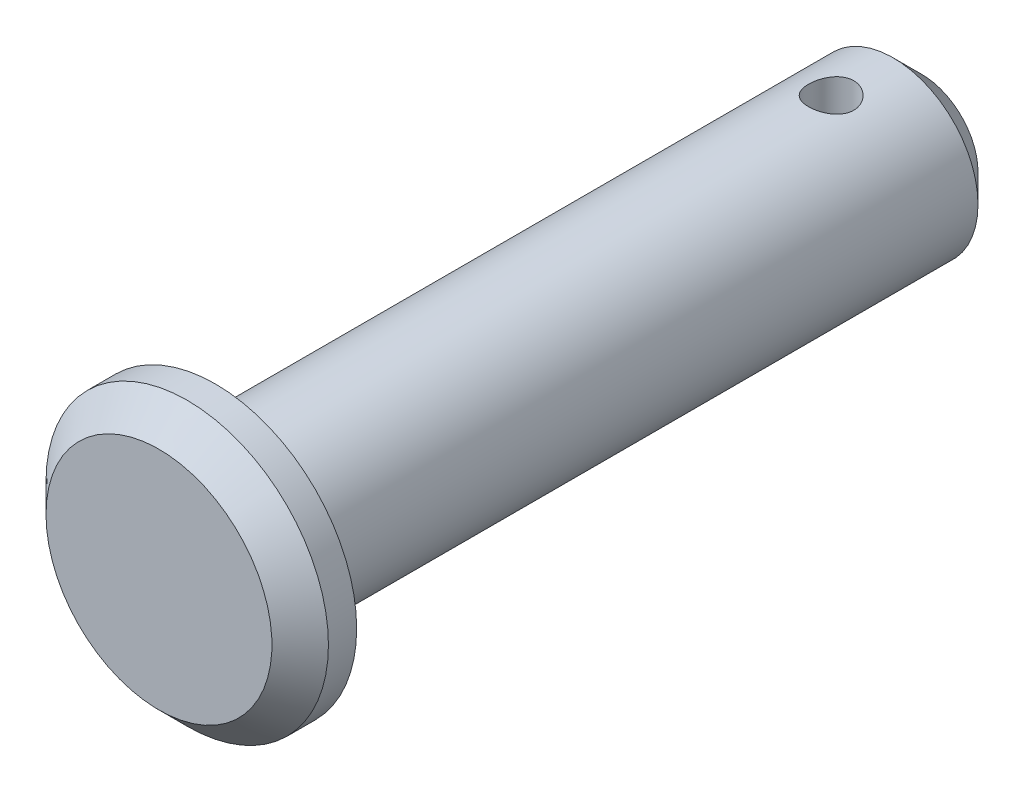
ISO-10303-21;
HEADER;
FILE_DESCRIPTION(('STEP AP214'),'2;1');
FILE_NAME('part.step','',(''),(''),'','','');
FILE_SCHEMA(('AUTOMOTIVE_DESIGN { 1 0 10303 214 1 1 1 1 }'));
ENDSEC;
DATA;
#1=APPLICATION_CONTEXT('core data for automotive mechanical design processes');
#2=APPLICATION_PROTOCOL_DEFINITION('international standard','automotive_design',2000,#1);
#3=PRODUCT_CONTEXT('',#1,'mechanical');
#4=PRODUCT('Part','Part','',(#3));
#5=PRODUCT_RELATED_PRODUCT_CATEGORY('part','',(#4));
#6=PRODUCT_DEFINITION_FORMATION('','',#4);
#7=PRODUCT_DEFINITION_CONTEXT('part definition',#1,'design');
#8=PRODUCT_DEFINITION('design','',#6,#7);
#9=PRODUCT_DEFINITION_SHAPE('','',#8);
#10=(LENGTH_UNIT() NAMED_UNIT(*) SI_UNIT(.MILLI.,.METRE.));
#11=(NAMED_UNIT(*) PLANE_ANGLE_UNIT() SI_UNIT($,.RADIAN.));
#12=(NAMED_UNIT(*) SI_UNIT($,.STERADIAN.) SOLID_ANGLE_UNIT());
#13=UNCERTAINTY_MEASURE_WITH_UNIT(LENGTH_MEASURE(1.E-05),#10,'distance_accuracy_value','');
#14=(GEOMETRIC_REPRESENTATION_CONTEXT(3) GLOBAL_UNCERTAINTY_ASSIGNED_CONTEXT((#13)) GLOBAL_UNIT_ASSIGNED_CONTEXT((#10,
#11,#12)) REPRESENTATION_CONTEXT('',''));
#15=CARTESIAN_POINT('',(0.,0.,0.));
#16=DIRECTION('',(0.,0.,1.));
#17=DIRECTION('',(1.,0.,0.));
#18=AXIS2_PLACEMENT_3D('',#15,#16,#17);
#19=CARTESIAN_POINT('',(0.,-20.1940334543548,3.2));
#20=DIRECTION('',(0.,1.,0.));
#21=DIRECTION('',(0.,0.,1.));
#22=AXIS2_PLACEMENT_3D('',#19,#20,#21);
#23=CYLINDRICAL_SURFACE('',#22,0.8);
#24=CARTESIAN_POINT('',(0.,-3.,4.));
#25=CARTESIAN_POINT('',(-0.0441018223331423,-2.99999933524065,3.99999895322606));
#26=CARTESIAN_POINT('',(-0.0882148640887374,-2.99901794464862,3.99634095432413));
#27=CARTESIAN_POINT('',(-0.175170180541785,-2.99519829448663,3.98183150770452));
#28=CARTESIAN_POINT('',(-0.218011833327633,-2.9923591413303,3.97097659822954));
#29=CARTESIAN_POINT('',(-0.301156635618126,-2.98513733301121,3.94245133325437));
#30=CARTESIAN_POINT('',(-0.34146298040612,-2.98075666852169,3.92478976493358));
#31=CARTESIAN_POINT('',(-0.418541474557067,-2.97091479660652,3.88318510293336));
#32=CARTESIAN_POINT('',(-0.455313388179847,-2.96545351718002,3.8592415906563));
#33=CARTESIAN_POINT('',(-0.525131801496009,-2.95389845960869,3.80516659343462));
#34=CARTESIAN_POINT('',(-0.55808467594513,-2.9477938707174,3.7749165327966));
#35=CARTESIAN_POINT('',(-0.618514854642545,-2.93570963871569,3.70934060677474));
#36=CARTESIAN_POINT('',(-0.645991453982616,-2.92973001177898,3.67401408895329));
#37=CARTESIAN_POINT('',(-0.695145636973702,-2.91846214986764,3.59854070606949));
#38=CARTESIAN_POINT('',(-0.716715510946112,-2.91318755429117,3.5583214686941));
#39=CARTESIAN_POINT('',(-0.752750192307821,-2.90408590923454,3.47466395556422));
#40=CARTESIAN_POINT('',(-0.767216309804883,-2.9002585928704,3.4312262750719));
#41=CARTESIAN_POINT('',(-0.7883076809057,-2.89459646334927,3.34340178486933));
#42=CARTESIAN_POINT('',(-0.795102680979745,-2.89271859176123,3.29905858401913));
#43=CARTESIAN_POINT('',(-0.801188138824371,-2.89103932417876,3.20982492666682));
#44=CARTESIAN_POINT('',(-0.800479998822945,-2.89123754019361,3.16493457398574));
#45=CARTESIAN_POINT('',(-0.791714040010483,-2.89364951507618,3.07720583385104));
#46=CARTESIAN_POINT('',(-0.783861624258972,-2.89580694201076,3.03434512718478));
#47=CARTESIAN_POINT('',(-0.761358994888813,-2.90180405235812,2.95057266621731));
#48=CARTESIAN_POINT('',(-0.746708237972003,-2.90564387021998,2.9096610679698));
#49=CARTESIAN_POINT('',(-0.710857427861,-2.91462264698391,2.83041274247661));
#50=CARTESIAN_POINT('',(-0.689585364551126,-2.91977577127223,2.7921102642855));
#51=CARTESIAN_POINT('',(-0.641146015295112,-2.93079291857237,2.71954633645937));
#52=CARTESIAN_POINT('',(-0.613977568897008,-2.93665708142145,2.6852856843374));
#53=CARTESIAN_POINT('',(-0.553466429053674,-2.94867004251873,2.62060440101807));
#54=CARTESIAN_POINT('',(-0.519951250913191,-2.95482188595513,2.59034547267402));
#55=CARTESIAN_POINT('',(-0.448247067282543,-2.96654552510546,2.53584448785988));
#56=CARTESIAN_POINT('',(-0.410057877682035,-2.97211729795427,2.51160266851902));
#57=CARTESIAN_POINT('',(-0.32983930219898,-2.98208728159312,2.46975283887013));
#58=CARTESIAN_POINT('',(-0.287793961020712,-2.98648029133423,2.45217409182056));
#59=CARTESIAN_POINT('',(-0.201200917756154,-2.99356017760401,2.42438112447465));
#60=CARTESIAN_POINT('',(-0.156653764771328,-2.996247426935,2.41416529491041));
#61=CARTESIAN_POINT('',(-0.0677016332582068,-2.99955663423354,2.40164204923286));
#62=CARTESIAN_POINT('',(-0.0233296950565524,-3.00023598988385,2.39911478405965));
#63=CARTESIAN_POINT('',(0.0652040183604796,-2.99961788676677,2.40143326569878));
#64=CARTESIAN_POINT('',(0.109365814824846,-2.99832063232137,2.4062782504423));
#65=CARTESIAN_POINT('',(0.195440979960712,-2.99393214198412,2.42302337898399));
#66=CARTESIAN_POINT('',(0.237379940811113,-2.99087210618546,2.43480089847911));
#67=CARTESIAN_POINT('',(0.31868278847042,-2.98330517957641,2.46493437780317));
#68=CARTESIAN_POINT('',(0.358046395686399,-2.9787981319841,2.48329105050017));
#69=CARTESIAN_POINT('',(0.433935389867192,-2.96870264223868,2.52646955487224));
#70=CARTESIAN_POINT('',(0.470390075384516,-2.96309474642193,2.55141098671923));
#71=CARTESIAN_POINT('',(0.538673854158807,-2.95144580946015,2.60690065206306));
#72=CARTESIAN_POINT('',(0.570502031519497,-2.94540468290222,2.6374499930399));
#73=CARTESIAN_POINT('',(0.629555697915275,-2.9333589834749,2.70431423099834));
#74=CARTESIAN_POINT('',(0.656626076999939,-2.92736024574782,2.74076742456005));
#75=CARTESIAN_POINT('',(0.704268764739789,-2.91626578870035,2.81782587843785));
#76=CARTESIAN_POINT('',(0.724841344486107,-2.91117003171109,2.85843096544148));
#77=CARTESIAN_POINT('',(0.758749646345945,-2.9025170736066,2.94243812283527));
#78=CARTESIAN_POINT('',(0.772127249023588,-2.89895099369493,2.98582232474924));
#79=CARTESIAN_POINT('',(0.79136482048317,-2.89375930092876,3.07433572789352));
#80=CARTESIAN_POINT('',(0.797226710411951,-2.89213319219128,3.11946448014682));
#81=CARTESIAN_POINT('',(0.801155958613013,-2.89104697818674,3.20859791514901));
#82=CARTESIAN_POINT('',(0.799472622471942,-2.89151759094413,3.2525909281021));
#83=CARTESIAN_POINT('',(0.78893750400225,-2.89440958435318,3.33964140560521));
#84=CARTESIAN_POINT('',(0.780085906140233,-2.89683091480545,3.38269889420054));
#85=CARTESIAN_POINT('',(0.755610062798667,-2.903310284285,3.46634230085161));
#86=CARTESIAN_POINT('',(0.740038644302288,-2.90735554007653,3.50694473709278));
#87=CARTESIAN_POINT('',(0.702606218249582,-2.91662727254676,3.58499153221374));
#88=CARTESIAN_POINT('',(0.680744224098475,-2.92185393448601,3.62243539452021));
#89=CARTESIAN_POINT('',(0.630595637075257,-2.93309168576127,3.69429214379862));
#90=CARTESIAN_POINT('',(0.602138919071638,-2.93912133240661,3.72858341399048));
#91=CARTESIAN_POINT('',(0.539932214044406,-2.95118201513218,3.79198498066693));
#92=CARTESIAN_POINT('',(0.506180941743499,-2.95721305119381,3.82109401546753));
#93=CARTESIAN_POINT('',(0.433471992435473,-2.96875124961583,3.87391689505873));
#94=CARTESIAN_POINT('',(0.394418384700715,-2.97424444525819,3.89750200425973));
#95=CARTESIAN_POINT('',(0.31275545616676,-2.9839352404116,3.93773496637174));
#96=CARTESIAN_POINT('',(0.270148437878519,-2.98813367073438,3.95438727026543));
#97=CARTESIAN_POINT('',(0.189749881952395,-2.99421901005387,3.9781101141662));
#98=CARTESIAN_POINT('',(0.152304806626014,-2.99637108237041,3.986299753437));
#99=CARTESIAN_POINT('',(0.0765759181268316,-2.99926179614582,3.99724488246683));
#100=CARTESIAN_POINT('',(0.0382921881619447,-3.00000057718908,4.00000090888001));
#101=CARTESIAN_POINT('',(0.,-3.,4.));
#102=B_SPLINE_CURVE_WITH_KNOTS('',3,(#24,#25,#26,#27,#28,#29,#30,#31,#32,#33,#34,#35,#36,#37,
#38,#39,#40,#41,#42,#43,#44,#45,#46,#47,#48,#49,#50,#51,#52,#53,#54,#55,#56,#57,#58,#59,#60,#61,
#62,#63,#64,#65,#66,#67,#68,#69,#70,#71,#72,#73,#74,#75,#76,#77,#78,#79,#80,#81,#82,#83,#84,#85,
#86,#87,#88,#89,#90,#91,#92,#93,#94,#95,#96,#97,#98,#99,#100,#101),.UNSPECIFIED.,.T.,.F.,(4,2,2,
2,2,2,2,2,2,2,2,2,2,2,2,2,2,2,2,2,2,2,2,2,2,2,2,2,2,2,2,2,2,2,2,2,2,2,4),(0.,0.132165039579828,
0.264393697504583,0.396452221188777,0.528519546834705,0.663339591819872,0.798176979700601,
0.935330330092923,1.07245837651881,1.20648863299036,1.34049384159394,1.47076400816065,
1.60104458722842,1.73279469336265,1.86457075244718,2.00064503922595,2.13672468772705,
2.27339523838883,2.41003590873721,2.54273087007485,2.67541211567806,2.80581414254512,
2.93623030307911,3.06920114399486,3.2021982730122,3.33894598550781,3.47568799207308,
3.61162519076595,3.7475276346153,3.87897336957382,4.01041572204174,4.14084306175258,
4.27129086845138,4.40557735824493,4.53989649728917,4.67708900908296,4.81419330454009,
4.92895927593272,5.04371391182491),.UNSPECIFIED.);
#103=CARTESIAN_POINT('',(0.,-3.,4.));
#104=VERTEX_POINT('',#103);
#105=EDGE_CURVE('E19',#104,#104,#102,.F.);
#106=ORIENTED_EDGE('',*,*,#105,.F.);
#107=EDGE_LOOP('',(#106));
#108=FACE_BOUND('',#107,.T.);
#109=CARTESIAN_POINT('',(0.,3.,4.));
#110=CARTESIAN_POINT('',(0.0441018223331423,2.99999933524065,3.99999895322606));
#111=CARTESIAN_POINT('',(0.0882148640887374,2.99901794464862,3.99634095432413));
#112=CARTESIAN_POINT('',(0.175170180541785,2.99519829448663,3.98183150770452));
#113=CARTESIAN_POINT('',(0.218011833327633,2.9923591413303,3.97097659822954));
#114=CARTESIAN_POINT('',(0.301156635618126,2.98513733301121,3.94245133325437));
#115=CARTESIAN_POINT('',(0.34146298040612,2.98075666852169,3.92478976493358));
#116=CARTESIAN_POINT('',(0.418541474557067,2.97091479660652,3.88318510293336));
#117=CARTESIAN_POINT('',(0.455313388179847,2.96545351718002,3.8592415906563));
#118=CARTESIAN_POINT('',(0.525131801496009,2.95389845960869,3.80516659343462));
#119=CARTESIAN_POINT('',(0.55808467594513,2.9477938707174,3.7749165327966));
#120=CARTESIAN_POINT('',(0.618514854642545,2.93570963871569,3.70934060677474));
#121=CARTESIAN_POINT('',(0.645991453982616,2.92973001177898,3.67401408895329));
#122=CARTESIAN_POINT('',(0.695145636973702,2.91846214986764,3.59854070606949));
#123=CARTESIAN_POINT('',(0.716715510946112,2.91318755429117,3.5583214686941));
#124=CARTESIAN_POINT('',(0.752750192307821,2.90408590923454,3.47466395556422));
#125=CARTESIAN_POINT('',(0.767216309804883,2.9002585928704,3.4312262750719));
#126=CARTESIAN_POINT('',(0.7883076809057,2.89459646334927,3.34340178486933));
#127=CARTESIAN_POINT('',(0.795102680979745,2.89271859176123,3.29905858401913));
#128=CARTESIAN_POINT('',(0.801188138824371,2.89103932417876,3.20982492666682));
#129=CARTESIAN_POINT('',(0.800479998822945,2.89123754019361,3.16493457398574));
#130=CARTESIAN_POINT('',(0.791714040010483,2.89364951507618,3.07720583385104));
#131=CARTESIAN_POINT('',(0.783861624258972,2.89580694201076,3.03434512718478));
#132=CARTESIAN_POINT('',(0.761358994888813,2.90180405235812,2.95057266621731));
#133=CARTESIAN_POINT('',(0.746708237972003,2.90564387021998,2.9096610679698));
#134=CARTESIAN_POINT('',(0.710857427861,2.91462264698391,2.83041274247661));
#135=CARTESIAN_POINT('',(0.689585364551126,2.91977577127223,2.7921102642855));
#136=CARTESIAN_POINT('',(0.641146015295112,2.93079291857237,2.71954633645937));
#137=CARTESIAN_POINT('',(0.613977568897008,2.93665708142145,2.6852856843374));
#138=CARTESIAN_POINT('',(0.553466429053674,2.94867004251873,2.62060440101807));
#139=CARTESIAN_POINT('',(0.519951250913191,2.95482188595513,2.59034547267402));
#140=CARTESIAN_POINT('',(0.448247067282543,2.96654552510546,2.53584448785988));
#141=CARTESIAN_POINT('',(0.410057877682035,2.97211729795427,2.51160266851902));
#142=CARTESIAN_POINT('',(0.32983930219898,2.98208728159312,2.46975283887013));
#143=CARTESIAN_POINT('',(0.287793961020712,2.98648029133423,2.45217409182056));
#144=CARTESIAN_POINT('',(0.201200917756154,2.99356017760401,2.42438112447465));
#145=CARTESIAN_POINT('',(0.156653764771328,2.996247426935,2.41416529491041));
#146=CARTESIAN_POINT('',(0.0677016332582068,2.99955663423354,2.40164204923286));
#147=CARTESIAN_POINT('',(0.0233296950565524,3.00023598988385,2.39911478405965));
#148=CARTESIAN_POINT('',(-0.0652040183604796,2.99961788676677,2.40143326569878));
#149=CARTESIAN_POINT('',(-0.109365814824846,2.99832063232137,2.4062782504423));
#150=CARTESIAN_POINT('',(-0.195440979960712,2.99393214198412,2.42302337898399));
#151=CARTESIAN_POINT('',(-0.237379940811113,2.99087210618546,2.43480089847911));
#152=CARTESIAN_POINT('',(-0.31868278847042,2.98330517957641,2.46493437780317));
#153=CARTESIAN_POINT('',(-0.358046395686399,2.9787981319841,2.48329105050017));
#154=CARTESIAN_POINT('',(-0.433935389867192,2.96870264223868,2.52646955487224));
#155=CARTESIAN_POINT('',(-0.470390075384516,2.96309474642193,2.55141098671923));
#156=CARTESIAN_POINT('',(-0.538673854158807,2.95144580946015,2.60690065206306));
#157=CARTESIAN_POINT('',(-0.570502031519497,2.94540468290222,2.6374499930399));
#158=CARTESIAN_POINT('',(-0.629555697915275,2.9333589834749,2.70431423099834));
#159=CARTESIAN_POINT('',(-0.656626076999939,2.92736024574782,2.74076742456005));
#160=CARTESIAN_POINT('',(-0.704268764739789,2.91626578870035,2.81782587843785));
#161=CARTESIAN_POINT('',(-0.724841344486107,2.91117003171109,2.85843096544148));
#162=CARTESIAN_POINT('',(-0.758749646345945,2.9025170736066,2.94243812283527));
#163=CARTESIAN_POINT('',(-0.772127249023588,2.89895099369493,2.98582232474924));
#164=CARTESIAN_POINT('',(-0.79136482048317,2.89375930092876,3.07433572789352));
#165=CARTESIAN_POINT('',(-0.797226710411951,2.89213319219128,3.11946448014682));
#166=CARTESIAN_POINT('',(-0.801155958613013,2.89104697818674,3.20859791514901));
#167=CARTESIAN_POINT('',(-0.799472622471942,2.89151759094413,3.2525909281021));
#168=CARTESIAN_POINT('',(-0.78893750400225,2.89440958435318,3.33964140560521));
#169=CARTESIAN_POINT('',(-0.780085906140233,2.89683091480545,3.38269889420054));
#170=CARTESIAN_POINT('',(-0.755610062798667,2.903310284285,3.46634230085161));
#171=CARTESIAN_POINT('',(-0.740038644302288,2.90735554007653,3.50694473709278));
#172=CARTESIAN_POINT('',(-0.702606218249582,2.91662727254676,3.58499153221374));
#173=CARTESIAN_POINT('',(-0.680744224098475,2.92185393448601,3.62243539452021));
#174=CARTESIAN_POINT('',(-0.630595637075257,2.93309168576127,3.69429214379862));
#175=CARTESIAN_POINT('',(-0.602138919071638,2.93912133240661,3.72858341399048));
#176=CARTESIAN_POINT('',(-0.539932214044406,2.95118201513218,3.79198498066693));
#177=CARTESIAN_POINT('',(-0.506180941743499,2.95721305119381,3.82109401546753));
#178=CARTESIAN_POINT('',(-0.433471992435473,2.96875124961583,3.87391689505873));
#179=CARTESIAN_POINT('',(-0.394418384700715,2.97424444525819,3.89750200425973));
#180=CARTESIAN_POINT('',(-0.31275545616676,2.9839352404116,3.93773496637174));
#181=CARTESIAN_POINT('',(-0.270148437878519,2.98813367073438,3.95438727026543));
#182=CARTESIAN_POINT('',(-0.189749881952395,2.99421901005387,3.9781101141662));
#183=CARTESIAN_POINT('',(-0.152304806626014,2.99637108237041,3.986299753437));
#184=CARTESIAN_POINT('',(-0.0765759181268316,2.99926179614582,3.99724488246683));
#185=CARTESIAN_POINT('',(-0.0382921881619447,3.00000057718908,4.00000090888001));
#186=CARTESIAN_POINT('',(0.,3.,4.));
#187=B_SPLINE_CURVE_WITH_KNOTS('',3,(#109,#110,#111,#112,#113,#114,#115,#116,#117,#118,#119,
#120,#121,#122,#123,#124,#125,#126,#127,#128,#129,#130,#131,#132,#133,#134,#135,#136,#137,#138,
#139,#140,#141,#142,#143,#144,#145,#146,#147,#148,#149,#150,#151,#152,#153,#154,#155,#156,#157,
#158,#159,#160,#161,#162,#163,#164,#165,#166,#167,#168,#169,#170,#171,#172,#173,#174,#175,#176,
#177,#178,#179,#180,#181,#182,#183,#184,#185,#186),.UNSPECIFIED.,.T.,.F.,(4,2,2,2,2,2,2,2,2,2,2,
2,2,2,2,2,2,2,2,2,2,2,2,2,2,2,2,2,2,2,2,2,2,2,2,2,2,2,4),(0.,0.132165039579828,
0.264393697504583,0.396452221188777,0.528519546834705,0.663339591819872,0.798176979700601,
0.935330330092923,1.07245837651881,1.20648863299036,1.34049384159394,1.47076400816065,
1.60104458722842,1.73279469336265,1.86457075244718,2.00064503922595,2.13672468772705,
2.27339523838883,2.41003590873721,2.54273087007485,2.67541211567806,2.80581414254512,
2.93623030307911,3.06920114399486,3.2021982730122,3.33894598550781,3.47568799207308,
3.61162519076595,3.7475276346153,3.87897336957382,4.01041572204174,4.14084306175258,
4.27129086845138,4.40557735824493,4.53989649728917,4.67708900908296,4.81419330454009,
4.92895927593272,5.04371391182491),.UNSPECIFIED.);
#188=CARTESIAN_POINT('',(0.,3.,4.));
#189=VERTEX_POINT('',#188);
#190=EDGE_CURVE('E42',#189,#189,#187,.F.);
#191=ORIENTED_EDGE('',*,*,#190,.F.);
#192=EDGE_LOOP('',(#191));
#193=FACE_BOUND('',#192,.T.);
#194=ADVANCED_FACE('F15',(#108,#193),#23,.F.);
#195=CARTESIAN_POINT('',(0.,0.,27.));
#196=DIRECTION('',(0.,0.,-1.));
#197=DIRECTION('',(-1.,0.,0.));
#198=AXIS2_PLACEMENT_3D('',#195,#196,#197);
#199=CONICAL_SURFACE('',#198,4.,0.785398163397447);
#200=CARTESIAN_POINT('',(0.,0.,27.));
#201=DIRECTION('',(0.,0.,1.));
#202=DIRECTION('',(-1.,0.,0.));
#203=AXIS2_PLACEMENT_3D('',#200,#201,#202);
#204=CIRCLE('',#203,4.);
#205=CARTESIAN_POINT('',(-4.,0.,27.));
#206=VERTEX_POINT('',#205);
#207=EDGE_CURVE('E10',#206,#206,#204,.T.);
#208=ORIENTED_EDGE('',*,*,#207,.F.);
#209=EDGE_LOOP('',(#208));
#210=FACE_BOUND('',#209,.T.);
#211=CARTESIAN_POINT('',(0.,0.,26.));
#212=DIRECTION('',(0.,0.,-1.));
#213=DIRECTION('',(-1.,0.,0.));
#214=AXIS2_PLACEMENT_3D('',#211,#212,#213);
#215=CIRCLE('',#214,5.);
#216=CARTESIAN_POINT('',(-5.,0.,26.));
#217=VERTEX_POINT('',#216);
#218=EDGE_CURVE('E29',#217,#217,#215,.T.);
#219=ORIENTED_EDGE('',*,*,#218,.F.);
#220=EDGE_LOOP('',(#219));
#221=FACE_BOUND('',#220,.T.);
#222=ADVANCED_FACE('F17',(#210,#221),#199,.T.);
#223=CARTESIAN_POINT('',(0.,0.,1.));
#224=DIRECTION('',(0.,0.,1.));
#225=DIRECTION('',(1.,0.,0.));
#226=AXIS2_PLACEMENT_3D('',#223,#224,#225);
#227=CONICAL_SURFACE('',#226,3.,0.785398163397448);
#228=CARTESIAN_POINT('',(0.,0.,1.));
#229=DIRECTION('',(0.,0.,1.));
#230=DIRECTION('',(1.,0.,0.));
#231=AXIS2_PLACEMENT_3D('',#228,#229,#230);
#232=CIRCLE('',#231,3.);
#233=CARTESIAN_POINT('',(3.,0.,1.));
#234=VERTEX_POINT('',#233);
#235=EDGE_CURVE('E48',#234,#234,#232,.T.);
#236=ORIENTED_EDGE('',*,*,#235,.F.);
#237=EDGE_LOOP('',(#236));
#238=FACE_BOUND('',#237,.T.);
#239=CARTESIAN_POINT('',(0.,0.,0.));
#240=DIRECTION('',(0.,0.,-1.));
#241=DIRECTION('',(1.,0.,0.));
#242=AXIS2_PLACEMENT_3D('',#239,#240,#241);
#243=CIRCLE('',#242,2.);
#244=CARTESIAN_POINT('',(2.,0.,0.));
#245=VERTEX_POINT('',#244);
#246=EDGE_CURVE('E88',#245,#245,#243,.T.);
#247=ORIENTED_EDGE('',*,*,#246,.F.);
#248=EDGE_LOOP('',(#247));
#249=FACE_BOUND('',#248,.T.);
#250=ADVANCED_FACE('F66',(#238,#249),#227,.T.);
#251=CARTESIAN_POINT('',(5.,0.,27.));
#252=DIRECTION('',(0.,0.,-1.));
#253=DIRECTION('',(0.,-1.,0.));
#254=AXIS2_PLACEMENT_3D('',#251,#252,#253);
#255=PLANE('',#254);
#256=ORIENTED_EDGE('',*,*,#207,.T.);
#257=EDGE_LOOP('',(#256));
#258=FACE_BOUND('',#257,.T.);
#259=ADVANCED_FACE('F63',(#258),#255,.F.);
#260=CARTESIAN_POINT('',(0.,0.,63.));
#261=DIRECTION('',(0.,0.,1.));
#262=DIRECTION('',(1.,0.,0.));
#263=AXIS2_PLACEMENT_3D('',#260,#261,#262);
#264=CYLINDRICAL_SURFACE('',#263,5.);
#265=CARTESIAN_POINT('',(0.,0.,25.));
#266=DIRECTION('',(0.,0.,1.));
#267=DIRECTION('',(1.,0.,0.));
#268=AXIS2_PLACEMENT_3D('',#265,#266,#267);
#269=CIRCLE('',#268,5.);
#270=CARTESIAN_POINT('',(5.,0.,25.));
#271=VERTEX_POINT('',#270);
#272=EDGE_CURVE('E39',#271,#271,#269,.T.);
#273=ORIENTED_EDGE('',*,*,#272,.T.);
#274=EDGE_LOOP('',(#273));
#275=FACE_BOUND('',#274,.T.);
#276=ORIENTED_EDGE('',*,*,#218,.T.);
#277=EDGE_LOOP('',(#276));
#278=FACE_BOUND('',#277,.T.);
#279=ADVANCED_FACE('F60',(#275,#278),#264,.T.);
#280=CARTESIAN_POINT('',(3.,0.,25.));
#281=DIRECTION('',(0.,0.,1.));
#282=DIRECTION('',(1.,0.,0.));
#283=AXIS2_PLACEMENT_3D('',#280,#281,#282);
#284=PLANE('',#283);
#285=CARTESIAN_POINT('',(0.,0.,25.));
#286=DIRECTION('',(0.,0.,1.));
#287=DIRECTION('',(1.,0.,0.));
#288=AXIS2_PLACEMENT_3D('',#285,#286,#287);
#289=CIRCLE('',#288,3.);
#290=CARTESIAN_POINT('',(3.,0.,25.));
#291=VERTEX_POINT('',#290);
#292=EDGE_CURVE('E97',#291,#291,#289,.T.);
#293=ORIENTED_EDGE('',*,*,#292,.T.);
#294=EDGE_LOOP('',(#293));
#295=FACE_BOUND('',#294,.T.);
#296=ORIENTED_EDGE('',*,*,#272,.F.);
#297=EDGE_LOOP('',(#296));
#298=FACE_BOUND('',#297,.T.);
#299=ADVANCED_FACE('F56',(#295,#298),#284,.F.);
#300=CARTESIAN_POINT('',(0.,0.,63.));
#301=DIRECTION('',(0.,0.,1.));
#302=DIRECTION('',(1.,0.,0.));
#303=AXIS2_PLACEMENT_3D('',#300,#301,#302);
#304=CYLINDRICAL_SURFACE('',#303,3.);
#305=ORIENTED_EDGE('',*,*,#292,.F.);
#306=EDGE_LOOP('',(#305));
#307=FACE_BOUND('',#306,.T.);
#308=ORIENTED_EDGE('',*,*,#235,.T.);
#309=EDGE_LOOP('',(#308));
#310=FACE_BOUND('',#309,.T.);
#311=ORIENTED_EDGE('',*,*,#190,.T.);
#312=EDGE_LOOP('',(#311));
#313=FACE_BOUND('',#312,.T.);
#314=ORIENTED_EDGE('',*,*,#105,.T.);
#315=EDGE_LOOP('',(#314));
#316=FACE_BOUND('',#315,.T.);
#317=ADVANCED_FACE('F49',(#307,#310,#313,#316),#304,.T.);
#318=CARTESIAN_POINT('',(0.,0.,0.));
#319=DIRECTION('',(0.,0.,1.));
#320=DIRECTION('',(1.,0.,0.));
#321=AXIS2_PLACEMENT_3D('',#318,#319,#320);
#322=PLANE('',#321);
#323=ORIENTED_EDGE('',*,*,#246,.T.);
#324=EDGE_LOOP('',(#323));
#325=FACE_BOUND('',#324,.T.);
#326=ADVANCED_FACE('F79',(#325),#322,.F.);
#327=CLOSED_SHELL('',(#194,#222,#250,#259,#279,#299,#317,#326));
#328=MANIFOLD_SOLID_BREP('B1',#327);
#329=ADVANCED_BREP_SHAPE_REPRESENTATION('',(#18,#328),#14);
#330=SHAPE_DEFINITION_REPRESENTATION(#9,#329);
ENDSEC;
END-ISO-10303-21;
